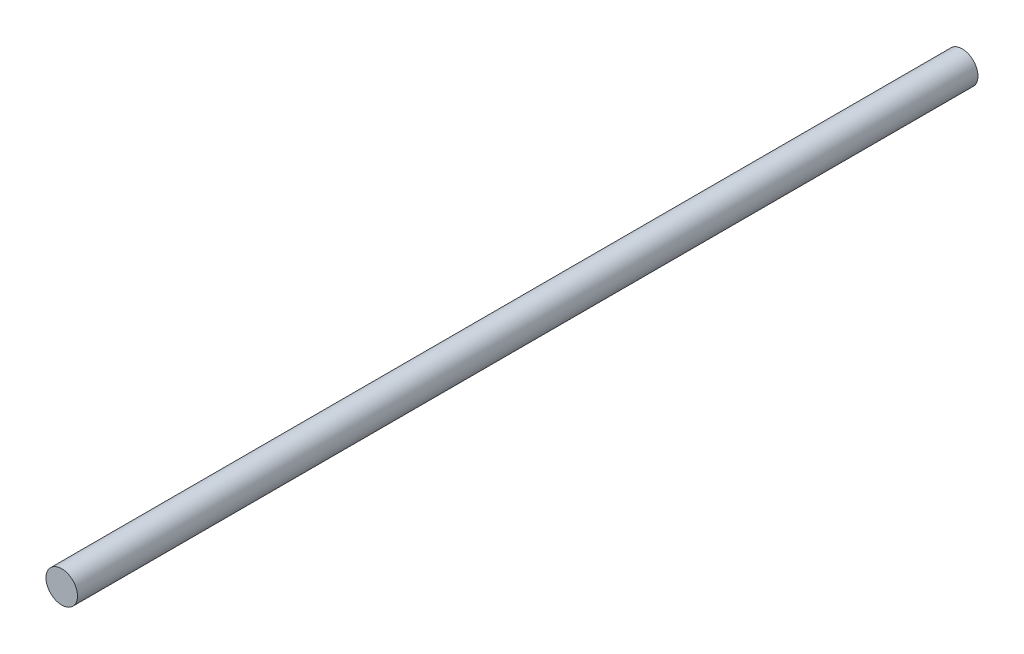
ISO-10303-21;
HEADER;
FILE_DESCRIPTION(('STEP AP214'),'2;1');
FILE_NAME('part.step','',(''),(''),'','','');
FILE_SCHEMA(('AUTOMOTIVE_DESIGN { 1 0 10303 214 1 1 1 1 }'));
ENDSEC;
DATA;
#1=APPLICATION_CONTEXT('core data for automotive mechanical design processes');
#2=APPLICATION_PROTOCOL_DEFINITION('international standard','automotive_design',2000,#1);
#3=PRODUCT_CONTEXT('',#1,'mechanical');
#4=PRODUCT('Part','Part','',(#3));
#5=PRODUCT_RELATED_PRODUCT_CATEGORY('part','',(#4));
#6=PRODUCT_DEFINITION_FORMATION('','',#4);
#7=PRODUCT_DEFINITION_CONTEXT('part definition',#1,'design');
#8=PRODUCT_DEFINITION('design','',#6,#7);
#9=PRODUCT_DEFINITION_SHAPE('','',#8);
#10=(LENGTH_UNIT() NAMED_UNIT(*) SI_UNIT(.MILLI.,.METRE.));
#11=(NAMED_UNIT(*) PLANE_ANGLE_UNIT() SI_UNIT($,.RADIAN.));
#12=(NAMED_UNIT(*) SI_UNIT($,.STERADIAN.) SOLID_ANGLE_UNIT());
#13=UNCERTAINTY_MEASURE_WITH_UNIT(LENGTH_MEASURE(1.E-05),#10,'distance_accuracy_value','');
#14=(GEOMETRIC_REPRESENTATION_CONTEXT(3) GLOBAL_UNCERTAINTY_ASSIGNED_CONTEXT((#13)) GLOBAL_UNIT_ASSIGNED_CONTEXT((#10,
#11,#12)) REPRESENTATION_CONTEXT('',''));
#15=CARTESIAN_POINT('',(0.,0.,0.));
#16=DIRECTION('',(0.,0.,1.));
#17=DIRECTION('',(1.,0.,0.));
#18=AXIS2_PLACEMENT_3D('',#15,#16,#17);
#19=CARTESIAN_POINT('',(0.,0.,100.));
#20=DIRECTION('',(0.,0.,-1.));
#21=DIRECTION('',(-1.,0.,0.));
#22=AXIS2_PLACEMENT_3D('',#19,#20,#21);
#23=CYLINDRICAL_SURFACE('',#22,1.75);
#24=CARTESIAN_POINT('',(0.,0.,100.));
#25=DIRECTION('',(0.,0.,1.));
#26=DIRECTION('',(1.,0.,0.));
#27=AXIS2_PLACEMENT_3D('',#24,#25,#26);
#28=CIRCLE('',#27,1.75);
#29=CARTESIAN_POINT('',(1.75,0.,100.));
#30=VERTEX_POINT('',#29);
#31=EDGE_CURVE('E10',#30,#30,#28,.T.);
#32=ORIENTED_EDGE('',*,*,#31,.F.);
#33=EDGE_LOOP('',(#32));
#34=FACE_BOUND('',#33,.T.);
#35=CARTESIAN_POINT('',(0.,0.,0.));
#36=DIRECTION('',(0.,0.,1.));
#37=DIRECTION('',(1.,0.,0.));
#38=AXIS2_PLACEMENT_3D('',#35,#36,#37);
#39=CIRCLE('',#38,1.75);
#40=CARTESIAN_POINT('',(1.75,0.,0.));
#41=VERTEX_POINT('',#40);
#42=EDGE_CURVE('E32',#41,#41,#39,.T.);
#43=ORIENTED_EDGE('',*,*,#42,.T.);
#44=EDGE_LOOP('',(#43));
#45=FACE_BOUND('',#44,.T.);
#46=ADVANCED_FACE('F29',(#34,#45),#23,.T.);
#47=CARTESIAN_POINT('',(0.,0.,100.));
#48=DIRECTION('',(0.,0.,1.));
#49=DIRECTION('',(1.,0.,0.));
#50=AXIS2_PLACEMENT_3D('',#47,#48,#49);
#51=PLANE('',#50);
#52=ORIENTED_EDGE('',*,*,#31,.T.);
#53=EDGE_LOOP('',(#52));
#54=FACE_BOUND('',#53,.T.);
#55=ADVANCED_FACE('F44',(#54),#51,.T.);
#56=CARTESIAN_POINT('',(0.,0.,0.));
#57=DIRECTION('',(0.,0.,1.));
#58=DIRECTION('',(1.,0.,0.));
#59=AXIS2_PLACEMENT_3D('',#56,#57,#58);
#60=PLANE('',#59);
#61=ORIENTED_EDGE('',*,*,#42,.F.);
#62=EDGE_LOOP('',(#61));
#63=FACE_BOUND('',#62,.T.);
#64=ADVANCED_FACE('F42',(#63),#60,.F.);
#65=CLOSED_SHELL('',(#46,#55,#64));
#66=MANIFOLD_SOLID_BREP('B2',#65);
#67=ADVANCED_BREP_SHAPE_REPRESENTATION('',(#18,#66),#14);
#68=SHAPE_DEFINITION_REPRESENTATION(#9,#67);
ENDSEC;
END-ISO-10303-21;
